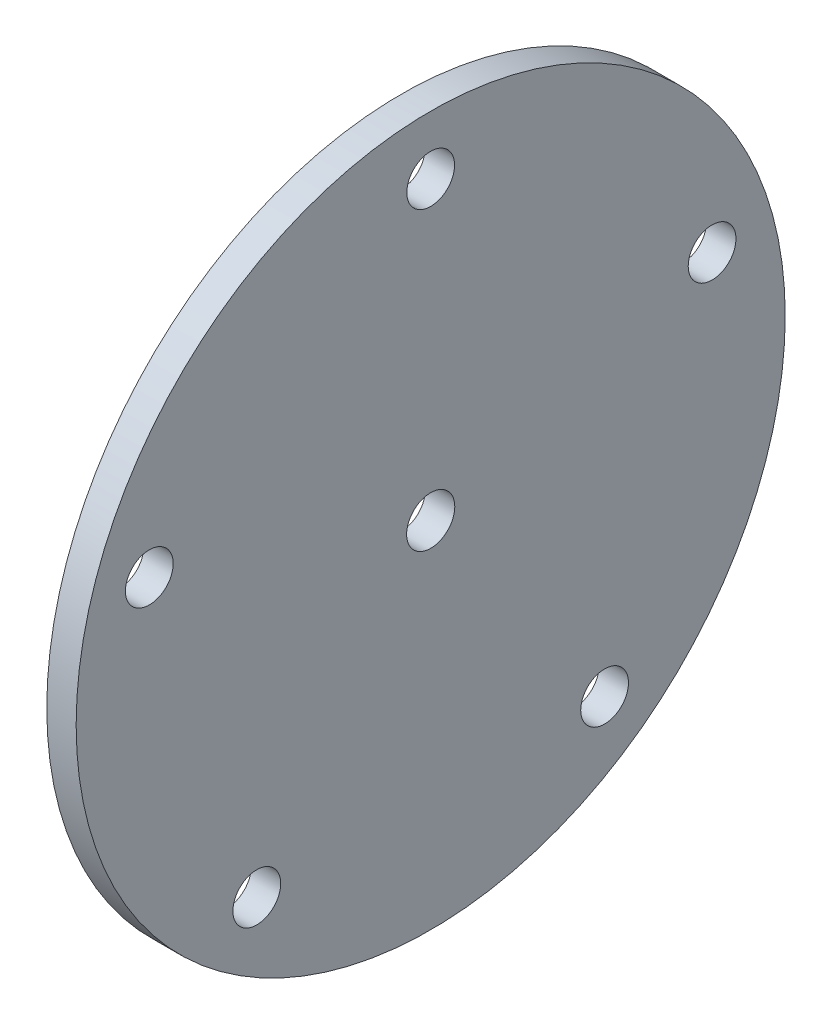
ISO-10303-21;
HEADER;
FILE_DESCRIPTION(('STEP AP214'),'2;1');
FILE_NAME('part.step','',(''),(''),'','','');
FILE_SCHEMA(('AUTOMOTIVE_DESIGN { 1 0 10303 214 1 1 1 1 }'));
ENDSEC;
DATA;
#1=APPLICATION_CONTEXT('core data for automotive mechanical design processes');
#2=APPLICATION_PROTOCOL_DEFINITION('international standard','automotive_design',2000,#1);
#3=PRODUCT_CONTEXT('',#1,'mechanical');
#4=PRODUCT('Part','Part','',(#3));
#5=PRODUCT_RELATED_PRODUCT_CATEGORY('part','',(#4));
#6=PRODUCT_DEFINITION_FORMATION('','',#4);
#7=PRODUCT_DEFINITION_CONTEXT('part definition',#1,'design');
#8=PRODUCT_DEFINITION('design','',#6,#7);
#9=PRODUCT_DEFINITION_SHAPE('','',#8);
#10=(LENGTH_UNIT() NAMED_UNIT(*) SI_UNIT(.MILLI.,.METRE.));
#11=(NAMED_UNIT(*) PLANE_ANGLE_UNIT() SI_UNIT($,.RADIAN.));
#12=(NAMED_UNIT(*) SI_UNIT($,.STERADIAN.) SOLID_ANGLE_UNIT());
#13=UNCERTAINTY_MEASURE_WITH_UNIT(LENGTH_MEASURE(1.E-05),#10,'distance_accuracy_value','');
#14=(GEOMETRIC_REPRESENTATION_CONTEXT(3) GLOBAL_UNCERTAINTY_ASSIGNED_CONTEXT((#13)) GLOBAL_UNIT_ASSIGNED_CONTEXT((#10,
#11,#12)) REPRESENTATION_CONTEXT('',''));
#15=CARTESIAN_POINT('',(0.,0.,0.));
#16=DIRECTION('',(0.,0.,1.));
#17=DIRECTION('',(1.,0.,0.));
#18=AXIS2_PLACEMENT_3D('',#15,#16,#17);
#19=CARTESIAN_POINT('',(2.5,0.,0.));
#20=DIRECTION('',(-1.,0.,0.));
#21=DIRECTION('',(0.,0.,1.));
#22=AXIS2_PLACEMENT_3D('',#19,#20,#21);
#23=CYLINDRICAL_SURFACE('',#22,60.325);
#24=CARTESIAN_POINT('',(2.5,0.,0.));
#25=DIRECTION('',(1.,0.,0.));
#26=DIRECTION('',(0.,0.,-1.));
#27=AXIS2_PLACEMENT_3D('',#24,#25,#26);
#28=CIRCLE('',#27,60.325);
#29=CARTESIAN_POINT('',(2.5,0.,-60.325));
#30=VERTEX_POINT('',#29);
#31=EDGE_CURVE('E10',#30,#30,#28,.T.);
#32=ORIENTED_EDGE('',*,*,#31,.F.);
#33=EDGE_LOOP('',(#32));
#34=FACE_BOUND('',#33,.T.);
#35=CARTESIAN_POINT('',(-2.5,0.,0.));
#36=DIRECTION('',(1.,0.,0.));
#37=DIRECTION('',(0.,0.,-1.));
#38=AXIS2_PLACEMENT_3D('',#35,#36,#37);
#39=CIRCLE('',#38,60.325);
#40=CARTESIAN_POINT('',(-2.5,0.,-60.325));
#41=VERTEX_POINT('',#40);
#42=EDGE_CURVE('E42',#41,#41,#39,.T.);
#43=ORIENTED_EDGE('',*,*,#42,.T.);
#44=EDGE_LOOP('',(#43));
#45=FACE_BOUND('',#44,.T.);
#46=ADVANCED_FACE('F39',(#34,#45),#23,.T.);
#47=CARTESIAN_POINT('',(2.5,0.,0.));
#48=DIRECTION('',(1.,0.,0.));
#49=DIRECTION('',(0.,0.,-1.));
#50=AXIS2_PLACEMENT_3D('',#47,#48,#49);
#51=PLANE('',#50);
#52=CARTESIAN_POINT('',(2.5,0.,0.));
#53=DIRECTION('',(1.,0.,0.));
#54=DIRECTION('',(0.,0.,-1.));
#55=AXIS2_PLACEMENT_3D('',#52,#53,#54);
#56=CIRCLE('',#55,4.1);
#57=CARTESIAN_POINT('',(2.5,0.,-4.1));
#58=VERTEX_POINT('',#57);
#59=EDGE_CURVE('E81',#58,#58,#56,.T.);
#60=ORIENTED_EDGE('',*,*,#59,.F.);
#61=EDGE_LOOP('',(#60));
#62=FACE_BOUND('',#61,.T.);
#63=CARTESIAN_POINT('',(2.5,50.342959834304,0.));
#64=DIRECTION('',(-1.,0.,0.));
#65=DIRECTION('',(0.,0.,1.));
#66=AXIS2_PLACEMENT_3D('',#63,#64,#65);
#67=CIRCLE('',#66,4.064);
#68=CARTESIAN_POINT('',(2.5,50.342959834304,4.064));
#69=VERTEX_POINT('',#68);
#70=EDGE_CURVE('E49',#69,#69,#67,.T.);
#71=ORIENTED_EDGE('',*,*,#70,.T.);
#72=EDGE_LOOP('',(#71));
#73=FACE_BOUND('',#72,.T.);
#74=CARTESIAN_POINT('',(2.5,15.5568301359353,47.879));
#75=DIRECTION('',(-1.,0.,0.));
#76=DIRECTION('',(0.,0.,1.));
#77=AXIS2_PLACEMENT_3D('',#74,#75,#76);
#78=CIRCLE('',#77,4.06400000000012);
#79=CARTESIAN_POINT('',(2.5,15.5568301359353,51.9430000000001));
#80=VERTEX_POINT('',#79);
#81=EDGE_CURVE('E70',#80,#80,#78,.T.);
#82=ORIENTED_EDGE('',*,*,#81,.T.);
#83=EDGE_LOOP('',(#82));
#84=FACE_BOUND('',#83,.T.);
#85=CARTESIAN_POINT('',(2.5,-40.7283100530873,29.5908493473562));
#86=DIRECTION('',(-1.,0.,0.));
#87=DIRECTION('',(0.,0.,1.));
#88=AXIS2_PLACEMENT_3D('',#85,#86,#87);
#89=CIRCLE('',#88,4.064);
#90=CARTESIAN_POINT('',(2.5,-40.7283100530873,33.6548493473562));
#91=VERTEX_POINT('',#90);
#92=EDGE_CURVE('E64',#91,#91,#89,.T.);
#93=ORIENTED_EDGE('',*,*,#92,.T.);
#94=EDGE_LOOP('',(#93));
#95=FACE_BOUND('',#94,.T.);
#96=CARTESIAN_POINT('',(2.5,-40.7283100530873,-29.5908493473562));
#97=DIRECTION('',(-1.,0.,0.));
#98=DIRECTION('',(0.,0.,1.));
#99=AXIS2_PLACEMENT_3D('',#96,#97,#98);
#100=CIRCLE('',#99,4.06399999999998);
#101=CARTESIAN_POINT('',(2.5,-40.7283100530873,-25.5268493473563));
#102=VERTEX_POINT('',#101);
#103=EDGE_CURVE('E58',#102,#102,#100,.T.);
#104=ORIENTED_EDGE('',*,*,#103,.T.);
#105=EDGE_LOOP('',(#104));
#106=FACE_BOUND('',#105,.T.);
#107=CARTESIAN_POINT('',(2.5,15.5568301359353,-47.879));
#108=DIRECTION('',(-1.,0.,0.));
#109=DIRECTION('',(0.,0.,1.));
#110=AXIS2_PLACEMENT_3D('',#107,#108,#109);
#111=CIRCLE('',#110,4.06399999999999);
#112=CARTESIAN_POINT('',(2.5,15.5568301359353,-43.815));
#113=VERTEX_POINT('',#112);
#114=EDGE_CURVE('E51',#113,#113,#111,.T.);
#115=ORIENTED_EDGE('',*,*,#114,.T.);
#116=EDGE_LOOP('',(#115));
#117=FACE_BOUND('',#116,.T.);
#118=ORIENTED_EDGE('',*,*,#31,.T.);
#119=EDGE_LOOP('',(#118));
#120=FACE_BOUND('',#119,.T.);
#121=ADVANCED_FACE('F97',(#62,#73,#84,#95,#106,#117,#120),#51,.T.);
#122=CARTESIAN_POINT('',(-2.5,0.,0.));
#123=DIRECTION('',(1.,0.,0.));
#124=DIRECTION('',(0.,0.,-1.));
#125=AXIS2_PLACEMENT_3D('',#122,#123,#124);
#126=PLANE('',#125);
#127=CARTESIAN_POINT('',(-2.5,0.,0.));
#128=DIRECTION('',(1.,0.,0.));
#129=DIRECTION('',(0.,0.,-1.));
#130=AXIS2_PLACEMENT_3D('',#127,#128,#129);
#131=CIRCLE('',#130,4.1);
#132=CARTESIAN_POINT('',(-2.5,0.,-4.1));
#133=VERTEX_POINT('',#132);
#134=EDGE_CURVE('E55',#133,#133,#131,.T.);
#135=ORIENTED_EDGE('',*,*,#134,.T.);
#136=EDGE_LOOP('',(#135));
#137=FACE_BOUND('',#136,.T.);
#138=CARTESIAN_POINT('',(-2.5,50.342959834304,0.));
#139=DIRECTION('',(-1.,0.,0.));
#140=DIRECTION('',(0.,0.,1.));
#141=AXIS2_PLACEMENT_3D('',#138,#139,#140);
#142=CIRCLE('',#141,4.064);
#143=CARTESIAN_POINT('',(-2.5,50.342959834304,4.064));
#144=VERTEX_POINT('',#143);
#145=EDGE_CURVE('E76',#144,#144,#142,.T.);
#146=ORIENTED_EDGE('',*,*,#145,.F.);
#147=EDGE_LOOP('',(#146));
#148=FACE_BOUND('',#147,.T.);
#149=CARTESIAN_POINT('',(-2.5,15.5568301359353,47.879));
#150=DIRECTION('',(-1.,0.,0.));
#151=DIRECTION('',(0.,0.,1.));
#152=AXIS2_PLACEMENT_3D('',#149,#150,#151);
#153=CIRCLE('',#152,4.06400000000012);
#154=CARTESIAN_POINT('',(-2.5,15.5568301359353,51.9430000000001));
#155=VERTEX_POINT('',#154);
#156=EDGE_CURVE('E73',#155,#155,#153,.T.);
#157=ORIENTED_EDGE('',*,*,#156,.F.);
#158=EDGE_LOOP('',(#157));
#159=FACE_BOUND('',#158,.T.);
#160=CARTESIAN_POINT('',(-2.5,-40.7283100530873,29.5908493473562));
#161=DIRECTION('',(-1.,0.,0.));
#162=DIRECTION('',(0.,0.,1.));
#163=AXIS2_PLACEMENT_3D('',#160,#161,#162);
#164=CIRCLE('',#163,4.064);
#165=CARTESIAN_POINT('',(-2.5,-40.7283100530873,33.6548493473562));
#166=VERTEX_POINT('',#165);
#167=EDGE_CURVE('E67',#166,#166,#164,.T.);
#168=ORIENTED_EDGE('',*,*,#167,.F.);
#169=EDGE_LOOP('',(#168));
#170=FACE_BOUND('',#169,.T.);
#171=CARTESIAN_POINT('',(-2.5,-40.7283100530873,-29.5908493473562));
#172=DIRECTION('',(-1.,0.,0.));
#173=DIRECTION('',(0.,0.,1.));
#174=AXIS2_PLACEMENT_3D('',#171,#172,#173);
#175=CIRCLE('',#174,4.06399999999998);
#176=CARTESIAN_POINT('',(-2.5,-40.7283100530873,-25.5268493473563));
#177=VERTEX_POINT('',#176);
#178=EDGE_CURVE('E61',#177,#177,#175,.T.);
#179=ORIENTED_EDGE('',*,*,#178,.F.);
#180=EDGE_LOOP('',(#179));
#181=FACE_BOUND('',#180,.T.);
#182=CARTESIAN_POINT('',(-2.5,15.5568301359353,-47.879));
#183=DIRECTION('',(-1.,0.,0.));
#184=DIRECTION('',(0.,0.,1.));
#185=AXIS2_PLACEMENT_3D('',#182,#183,#184);
#186=CIRCLE('',#185,4.06399999999999);
#187=CARTESIAN_POINT('',(-2.5,15.5568301359353,-43.815));
#188=VERTEX_POINT('',#187);
#189=EDGE_CURVE('E54',#188,#188,#186,.T.);
#190=ORIENTED_EDGE('',*,*,#189,.F.);
#191=EDGE_LOOP('',(#190));
#192=FACE_BOUND('',#191,.T.);
#193=ORIENTED_EDGE('',*,*,#42,.F.);
#194=EDGE_LOOP('',(#193));
#195=FACE_BOUND('',#194,.T.);
#196=ADVANCED_FACE('F87',(#137,#148,#159,#170,#181,#192,#195),#126,.F.);
#197=CARTESIAN_POINT('',(2.5,15.5568301359353,-47.879));
#198=DIRECTION('',(-1.,0.,0.));
#199=DIRECTION('',(0.,0.,1.));
#200=AXIS2_PLACEMENT_3D('',#197,#198,#199);
#201=CYLINDRICAL_SURFACE('',#200,4.06399999999999);
#202=ORIENTED_EDGE('',*,*,#114,.F.);
#203=EDGE_LOOP('',(#202));
#204=FACE_BOUND('',#203,.T.);
#205=ORIENTED_EDGE('',*,*,#189,.T.);
#206=EDGE_LOOP('',(#205));
#207=FACE_BOUND('',#206,.T.);
#208=ADVANCED_FACE('F111',(#204,#207),#201,.F.);
#209=CARTESIAN_POINT('',(2.5,-40.7283100530873,-29.5908493473562));
#210=DIRECTION('',(-1.,0.,0.));
#211=DIRECTION('',(0.,0.,1.));
#212=AXIS2_PLACEMENT_3D('',#209,#210,#211);
#213=CYLINDRICAL_SURFACE('',#212,4.06399999999998);
#214=ORIENTED_EDGE('',*,*,#103,.F.);
#215=EDGE_LOOP('',(#214));
#216=FACE_BOUND('',#215,.T.);
#217=ORIENTED_EDGE('',*,*,#178,.T.);
#218=EDGE_LOOP('',(#217));
#219=FACE_BOUND('',#218,.T.);
#220=ADVANCED_FACE('F114',(#216,#219),#213,.F.);
#221=CARTESIAN_POINT('',(2.5,-40.7283100530873,29.5908493473562));
#222=DIRECTION('',(-1.,0.,0.));
#223=DIRECTION('',(0.,0.,1.));
#224=AXIS2_PLACEMENT_3D('',#221,#222,#223);
#225=CYLINDRICAL_SURFACE('',#224,4.064);
#226=ORIENTED_EDGE('',*,*,#92,.F.);
#227=EDGE_LOOP('',(#226));
#228=FACE_BOUND('',#227,.T.);
#229=ORIENTED_EDGE('',*,*,#167,.T.);
#230=EDGE_LOOP('',(#229));
#231=FACE_BOUND('',#230,.T.);
#232=ADVANCED_FACE('F146',(#228,#231),#225,.F.);
#233=CARTESIAN_POINT('',(2.5,15.5568301359353,47.879));
#234=DIRECTION('',(-1.,0.,0.));
#235=DIRECTION('',(0.,0.,1.));
#236=AXIS2_PLACEMENT_3D('',#233,#234,#235);
#237=CYLINDRICAL_SURFACE('',#236,4.06400000000012);
#238=ORIENTED_EDGE('',*,*,#81,.F.);
#239=EDGE_LOOP('',(#238));
#240=FACE_BOUND('',#239,.T.);
#241=ORIENTED_EDGE('',*,*,#156,.T.);
#242=EDGE_LOOP('',(#241));
#243=FACE_BOUND('',#242,.T.);
#244=ADVANCED_FACE('F154',(#240,#243),#237,.F.);
#245=CARTESIAN_POINT('',(2.5,50.342959834304,0.));
#246=DIRECTION('',(-1.,0.,0.));
#247=DIRECTION('',(0.,0.,1.));
#248=AXIS2_PLACEMENT_3D('',#245,#246,#247);
#249=CYLINDRICAL_SURFACE('',#248,4.064);
#250=ORIENTED_EDGE('',*,*,#70,.F.);
#251=EDGE_LOOP('',(#250));
#252=FACE_BOUND('',#251,.T.);
#253=ORIENTED_EDGE('',*,*,#145,.T.);
#254=EDGE_LOOP('',(#253));
#255=FACE_BOUND('',#254,.T.);
#256=ADVANCED_FACE('F93',(#252,#255),#249,.F.);
#257=CARTESIAN_POINT('',(-2.5,0.,0.));
#258=DIRECTION('',(1.,0.,0.));
#259=DIRECTION('',(0.,0.,-1.));
#260=AXIS2_PLACEMENT_3D('',#257,#258,#259);
#261=CYLINDRICAL_SURFACE('',#260,4.1);
#262=ORIENTED_EDGE('',*,*,#134,.F.);
#263=EDGE_LOOP('',(#262));
#264=FACE_BOUND('',#263,.T.);
#265=ORIENTED_EDGE('',*,*,#59,.T.);
#266=EDGE_LOOP('',(#265));
#267=FACE_BOUND('',#266,.T.);
#268=ADVANCED_FACE('F90',(#264,#267),#261,.F.);
#269=CLOSED_SHELL('',(#46,#121,#196,#208,#220,#232,#244,#256,#268));
#270=MANIFOLD_SOLID_BREP('B2',#269);
#271=ADVANCED_BREP_SHAPE_REPRESENTATION('',(#18,#270),#14);
#272=SHAPE_DEFINITION_REPRESENTATION(#9,#271);
ENDSEC;
END-ISO-10303-21;
